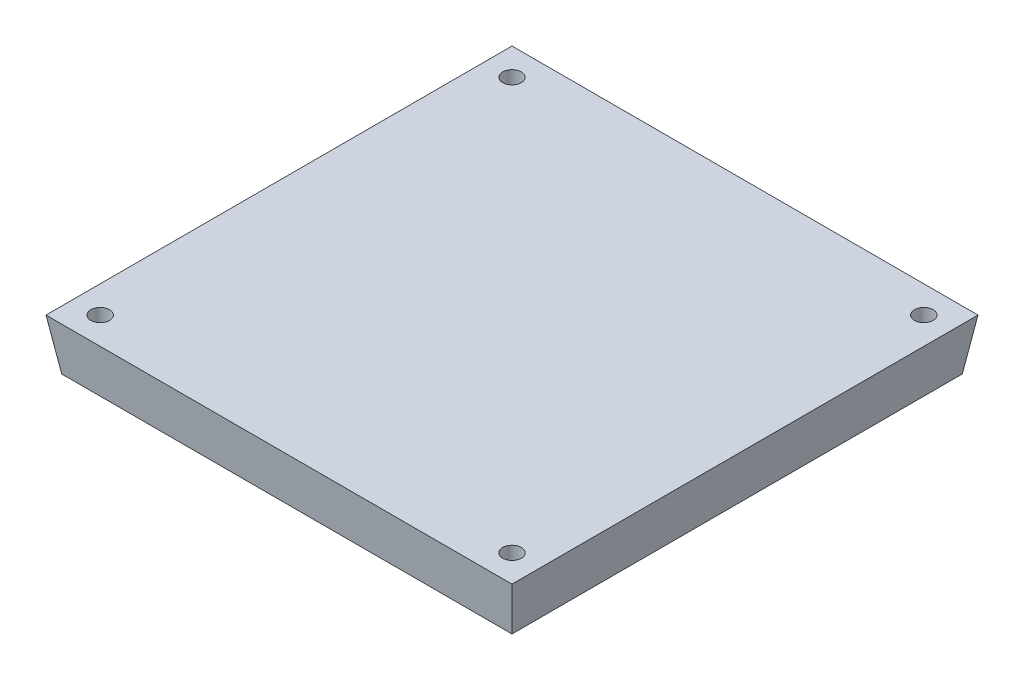
ISO-10303-21;
HEADER;
FILE_DESCRIPTION(('STEP AP214'),'2;1');
FILE_NAME('part.step','',(''),(''),'','','');
FILE_SCHEMA(('AUTOMOTIVE_DESIGN { 1 0 10303 214 1 1 1 1 }'));
ENDSEC;
DATA;
#1=APPLICATION_CONTEXT('core data for automotive mechanical design processes');
#2=APPLICATION_PROTOCOL_DEFINITION('international standard','automotive_design',2000,#1);
#3=PRODUCT_CONTEXT('',#1,'mechanical');
#4=PRODUCT('Part','Part','',(#3));
#5=PRODUCT_RELATED_PRODUCT_CATEGORY('part','',(#4));
#6=PRODUCT_DEFINITION_FORMATION('','',#4);
#7=PRODUCT_DEFINITION_CONTEXT('part definition',#1,'design');
#8=PRODUCT_DEFINITION('design','',#6,#7);
#9=PRODUCT_DEFINITION_SHAPE('','',#8);
#10=(LENGTH_UNIT() NAMED_UNIT(*) SI_UNIT(.MILLI.,.METRE.));
#11=(NAMED_UNIT(*) PLANE_ANGLE_UNIT() SI_UNIT($,.RADIAN.));
#12=(NAMED_UNIT(*) SI_UNIT($,.STERADIAN.) SOLID_ANGLE_UNIT());
#13=UNCERTAINTY_MEASURE_WITH_UNIT(LENGTH_MEASURE(1.E-05),#10,'distance_accuracy_value','');
#14=(GEOMETRIC_REPRESENTATION_CONTEXT(3) GLOBAL_UNCERTAINTY_ASSIGNED_CONTEXT((#13)) GLOBAL_UNIT_ASSIGNED_CONTEXT((#10,
#11,#12)) REPRESENTATION_CONTEXT('',''));
#15=CARTESIAN_POINT('',(0.,0.,0.));
#16=DIRECTION('',(0.,0.,1.));
#17=DIRECTION('',(1.,0.,0.));
#18=AXIS2_PLACEMENT_3D('',#15,#16,#17);
#19=CARTESIAN_POINT('',(36.15,0.,-36.15));
#20=DIRECTION('',(0.988308349175247,-0.152468380166177,0.));
#21=DIRECTION('',(0.152468380166177,0.988308349175247,0.));
#22=AXIS2_PLACEMENT_3D('',#19,#20,#21);
#23=PLANE('',#22);
#24=DIRECTION('',(0.,0.,-1.));
#25=VECTOR('',#24,1.);
#26=CARTESIAN_POINT('',(36.15,0.,-36.15));
#27=LINE('',#26,#25);
#28=CARTESIAN_POINT('',(36.15,0.,36.15));
#29=VERTEX_POINT('',#28);
#30=CARTESIAN_POINT('',(36.15,0.,-36.15));
#31=VERTEX_POINT('',#30);
#32=EDGE_CURVE('E93',#29,#31,#27,.T.);
#33=ORIENTED_EDGE('',*,*,#32,.T.);
#34=DIRECTION('',(-0.150726505265711,-0.977017421144972,0.150726505265711));
#35=VECTOR('',#34,1.);
#36=CARTESIAN_POINT('',(34.5074539401309,-10.6470730724906,-34.5074539401309));
#37=LINE('',#36,#35);
#38=CARTESIAN_POINT('',(37.4150310183112,8.2,-37.4150310183112));
#39=VERTEX_POINT('',#38);
#40=EDGE_CURVE('E11',#39,#31,#37,.T.);
#41=ORIENTED_EDGE('',*,*,#40,.F.);
#42=DIRECTION('',(0.,0.,1.));
#43=VECTOR('',#42,1.);
#44=CARTESIAN_POINT('',(37.4150310183112,8.2,-36.15));
#45=LINE('',#44,#43);
#46=CARTESIAN_POINT('',(37.4150310183112,8.2,37.4150310183112));
#47=VERTEX_POINT('',#46);
#48=EDGE_CURVE('E119',#47,#39,#45,.F.);
#49=ORIENTED_EDGE('',*,*,#48,.F.);
#50=DIRECTION('',(-0.150726505265712,-0.977017421144972,-0.150726505265711));
#51=VECTOR('',#50,1.);
#52=CARTESIAN_POINT('',(34.5074539401309,-10.6470730724906,34.5074539401309));
#53=LINE('',#52,#51);
#54=EDGE_CURVE('E105',#47,#29,#53,.T.);
#55=ORIENTED_EDGE('',*,*,#54,.T.);
#56=EDGE_LOOP('',(#33,#41,#49,#55));
#57=FACE_BOUND('',#56,.T.);
#58=ADVANCED_FACE('F45',(#57),#23,.T.);
#59=CARTESIAN_POINT('',(-36.15,0.,-36.15));
#60=DIRECTION('',(0.,-0.152468380166177,-0.988308349175247));
#61=DIRECTION('',(0.,0.988308349175247,-0.152468380166177));
#62=AXIS2_PLACEMENT_3D('',#59,#60,#61);
#63=PLANE('',#62);
#64=DIRECTION('',(-1.,0.,0.));
#65=VECTOR('',#64,1.);
#66=CARTESIAN_POINT('',(-36.15,0.,-36.15));
#67=LINE('',#66,#65);
#68=CARTESIAN_POINT('',(-36.15,0.,-36.15));
#69=VERTEX_POINT('',#68);
#70=EDGE_CURVE('E89',#31,#69,#67,.T.);
#71=ORIENTED_EDGE('',*,*,#70,.T.);
#72=DIRECTION('',(0.150726505265712,-0.977017421144972,0.150726505265711));
#73=VECTOR('',#72,1.);
#74=CARTESIAN_POINT('',(-36.15,0.,-36.15));
#75=LINE('',#74,#73);
#76=CARTESIAN_POINT('',(-37.4150310183112,8.2,-37.4150310183112));
#77=VERTEX_POINT('',#76);
#78=EDGE_CURVE('E55',#77,#69,#75,.T.);
#79=ORIENTED_EDGE('',*,*,#78,.F.);
#80=DIRECTION('',(1.,0.,0.));
#81=VECTOR('',#80,1.);
#82=CARTESIAN_POINT('',(-36.15,8.2,-37.4150310183112));
#83=LINE('',#82,#81);
#84=EDGE_CURVE('E101',#39,#77,#83,.F.);
#85=ORIENTED_EDGE('',*,*,#84,.F.);
#86=ORIENTED_EDGE('',*,*,#40,.T.);
#87=EDGE_LOOP('',(#71,#79,#85,#86));
#88=FACE_BOUND('',#87,.T.);
#89=ADVANCED_FACE('F47',(#88),#63,.T.);
#90=CARTESIAN_POINT('',(-36.15,0.,-36.15));
#91=DIRECTION('',(-0.988308349175247,-0.152468380166177,0.));
#92=DIRECTION('',(0.152468380166177,-0.988308349175247,0.));
#93=AXIS2_PLACEMENT_3D('',#90,#91,#92);
#94=PLANE('',#93);
#95=DIRECTION('',(0.,0.,1.));
#96=VECTOR('',#95,1.);
#97=CARTESIAN_POINT('',(-36.15,0.,-36.15));
#98=LINE('',#97,#96);
#99=CARTESIAN_POINT('',(-36.15,0.,36.15));
#100=VERTEX_POINT('',#99);
#101=EDGE_CURVE('E94',#69,#100,#98,.T.);
#102=ORIENTED_EDGE('',*,*,#101,.T.);
#103=DIRECTION('',(0.150726505265711,-0.977017421144972,-0.150726505265711));
#104=VECTOR('',#103,1.);
#105=CARTESIAN_POINT('',(-36.15,0.,36.15));
#106=LINE('',#105,#104);
#107=CARTESIAN_POINT('',(-37.4150310183112,8.2,37.4150310183112));
#108=VERTEX_POINT('',#107);
#109=EDGE_CURVE('E123',#108,#100,#106,.T.);
#110=ORIENTED_EDGE('',*,*,#109,.F.);
#111=DIRECTION('',(0.,0.,-1.));
#112=VECTOR('',#111,1.);
#113=CARTESIAN_POINT('',(-37.4150310183112,8.2,-36.15));
#114=LINE('',#113,#112);
#115=EDGE_CURVE('E68',#77,#108,#114,.F.);
#116=ORIENTED_EDGE('',*,*,#115,.F.);
#117=ORIENTED_EDGE('',*,*,#78,.T.);
#118=EDGE_LOOP('',(#102,#110,#116,#117));
#119=FACE_BOUND('',#118,.T.);
#120=ADVANCED_FACE('F171',(#119),#94,.T.);
#121=CARTESIAN_POINT('',(-36.15,0.,36.15));
#122=DIRECTION('',(0.,-0.152468380166177,0.988308349175247));
#123=DIRECTION('',(0.,-0.988308349175247,-0.152468380166177));
#124=AXIS2_PLACEMENT_3D('',#121,#122,#123);
#125=PLANE('',#124);
#126=DIRECTION('',(1.,0.,0.));
#127=VECTOR('',#126,1.);
#128=CARTESIAN_POINT('',(-36.15,0.,36.15));
#129=LINE('',#128,#127);
#130=EDGE_CURVE('E117',#100,#29,#129,.T.);
#131=ORIENTED_EDGE('',*,*,#130,.T.);
#132=ORIENTED_EDGE('',*,*,#54,.F.);
#133=DIRECTION('',(-1.,0.,0.));
#134=VECTOR('',#133,1.);
#135=CARTESIAN_POINT('',(-36.15,8.2,37.4150310183112));
#136=LINE('',#135,#134);
#137=EDGE_CURVE('E63',#108,#47,#136,.F.);
#138=ORIENTED_EDGE('',*,*,#137,.F.);
#139=ORIENTED_EDGE('',*,*,#109,.T.);
#140=EDGE_LOOP('',(#131,#132,#138,#139));
#141=FACE_BOUND('',#140,.T.);
#142=ADVANCED_FACE('F175',(#141),#125,.T.);
#143=CARTESIAN_POINT('',(0.,8.2,0.));
#144=DIRECTION('',(0.,1.,0.));
#145=DIRECTION('',(0.,0.,1.));
#146=AXIS2_PLACEMENT_3D('',#143,#144,#145);
#147=PLANE('',#146);
#148=CARTESIAN_POINT('',(-33.0666010183116,8.2,33.0666010183109));
#149=DIRECTION('',(0.,1.,0.));
#150=DIRECTION('',(0.,0.,1.));
#151=AXIS2_PLACEMENT_3D('',#148,#149,#150);
#152=CIRCLE('',#151,1.50000000000001);
#153=CARTESIAN_POINT('',(-33.0666010183116,8.2,34.5666010183109));
#154=VERTEX_POINT('',#153);
#155=EDGE_CURVE('E210',#154,#154,#152,.T.);
#156=ORIENTED_EDGE('',*,*,#155,.F.);
#157=EDGE_LOOP('',(#156));
#158=FACE_BOUND('',#157,.T.);
#159=CARTESIAN_POINT('',(33.066601018311,8.2,33.0666010183115));
#160=DIRECTION('',(0.,1.,0.));
#161=DIRECTION('',(0.,0.,1.));
#162=AXIS2_PLACEMENT_3D('',#159,#160,#161);
#163=CIRCLE('',#162,1.50000000000001);
#164=CARTESIAN_POINT('',(33.066601018311,8.2,34.5666010183115));
#165=VERTEX_POINT('',#164);
#166=EDGE_CURVE('E206',#165,#165,#163,.T.);
#167=ORIENTED_EDGE('',*,*,#166,.F.);
#168=EDGE_LOOP('',(#167));
#169=FACE_BOUND('',#168,.T.);
#170=CARTESIAN_POINT('',(33.0666010183114,8.2,-33.0666010183111));
#171=DIRECTION('',(0.,1.,0.));
#172=DIRECTION('',(0.,0.,1.));
#173=AXIS2_PLACEMENT_3D('',#170,#171,#172);
#174=CIRCLE('',#173,1.5);
#175=CARTESIAN_POINT('',(33.0666010183114,8.2,-31.5666010183111));
#176=VERTEX_POINT('',#175);
#177=EDGE_CURVE('E203',#176,#176,#174,.T.);
#178=ORIENTED_EDGE('',*,*,#177,.F.);
#179=EDGE_LOOP('',(#178));
#180=FACE_BOUND('',#179,.T.);
#181=CARTESIAN_POINT('',(-33.0666010183112,8.2,-33.0666010183112));
#182=DIRECTION('',(0.,1.,0.));
#183=DIRECTION('',(0.,0.,1.));
#184=AXIS2_PLACEMENT_3D('',#181,#182,#183);
#185=CIRCLE('',#184,1.5);
#186=CARTESIAN_POINT('',(-33.0666010183112,8.2,-31.5666010183112));
#187=VERTEX_POINT('',#186);
#188=EDGE_CURVE('E112',#187,#187,#185,.T.);
#189=ORIENTED_EDGE('',*,*,#188,.F.);
#190=EDGE_LOOP('',(#189));
#191=FACE_BOUND('',#190,.T.);
#192=ORIENTED_EDGE('',*,*,#48,.T.);
#193=ORIENTED_EDGE('',*,*,#84,.T.);
#194=ORIENTED_EDGE('',*,*,#115,.T.);
#195=ORIENTED_EDGE('',*,*,#137,.T.);
#196=EDGE_LOOP('',(#192,#193,#194,#195));
#197=FACE_BOUND('',#196,.T.);
#198=ADVANCED_FACE('F177',(#158,#169,#180,#191,#197),#147,.T.);
#199=CARTESIAN_POINT('',(0.,0.,0.));
#200=DIRECTION('',(0.,1.,0.));
#201=DIRECTION('',(0.,0.,1.));
#202=AXIS2_PLACEMENT_3D('',#199,#200,#201);
#203=PLANE('',#202);
#204=CARTESIAN_POINT('',(-33.0666010183116,0.,33.0666010183109));
#205=DIRECTION('',(0.,1.,0.));
#206=DIRECTION('',(0.,0.,1.));
#207=AXIS2_PLACEMENT_3D('',#204,#205,#206);
#208=CIRCLE('',#207,1.50000000000001);
#209=CARTESIAN_POINT('',(-33.0666010183116,0.,34.5666010183109));
#210=VERTEX_POINT('',#209);
#211=EDGE_CURVE('E49',#210,#210,#208,.T.);
#212=ORIENTED_EDGE('',*,*,#211,.T.);
#213=EDGE_LOOP('',(#212));
#214=FACE_BOUND('',#213,.T.);
#215=CARTESIAN_POINT('',(33.066601018311,0.,33.0666010183115));
#216=DIRECTION('',(0.,1.,0.));
#217=DIRECTION('',(0.,0.,1.));
#218=AXIS2_PLACEMENT_3D('',#215,#216,#217);
#219=CIRCLE('',#218,1.50000000000001);
#220=CARTESIAN_POINT('',(33.066601018311,0.,34.5666010183115));
#221=VERTEX_POINT('',#220);
#222=EDGE_CURVE('E110',#221,#221,#219,.T.);
#223=ORIENTED_EDGE('',*,*,#222,.T.);
#224=EDGE_LOOP('',(#223));
#225=FACE_BOUND('',#224,.T.);
#226=CARTESIAN_POINT('',(33.0666010183114,0.,-33.0666010183111));
#227=DIRECTION('',(0.,1.,0.));
#228=DIRECTION('',(0.,0.,1.));
#229=AXIS2_PLACEMENT_3D('',#226,#227,#228);
#230=CIRCLE('',#229,1.5);
#231=CARTESIAN_POINT('',(33.0666010183114,0.,-31.5666010183111));
#232=VERTEX_POINT('',#231);
#233=EDGE_CURVE('E141',#232,#232,#230,.T.);
#234=ORIENTED_EDGE('',*,*,#233,.T.);
#235=EDGE_LOOP('',(#234));
#236=FACE_BOUND('',#235,.T.);
#237=CARTESIAN_POINT('',(-33.0666010183112,0.,-33.0666010183112));
#238=DIRECTION('',(0.,1.,0.));
#239=DIRECTION('',(0.,0.,1.));
#240=AXIS2_PLACEMENT_3D('',#237,#238,#239);
#241=CIRCLE('',#240,1.5);
#242=CARTESIAN_POINT('',(-33.0666010183112,0.,-31.5666010183112));
#243=VERTEX_POINT('',#242);
#244=EDGE_CURVE('E137',#243,#243,#241,.T.);
#245=ORIENTED_EDGE('',*,*,#244,.T.);
#246=EDGE_LOOP('',(#245));
#247=FACE_BOUND('',#246,.T.);
#248=ORIENTED_EDGE('',*,*,#32,.F.);
#249=ORIENTED_EDGE('',*,*,#130,.F.);
#250=ORIENTED_EDGE('',*,*,#101,.F.);
#251=ORIENTED_EDGE('',*,*,#70,.F.);
#252=EDGE_LOOP('',(#248,#249,#250,#251));
#253=FACE_BOUND('',#252,.T.);
#254=ADVANCED_FACE('F90',(#214,#225,#236,#247,#253),#203,.F.);
#255=CARTESIAN_POINT('',(-33.0666010183112,-1.8,-33.0666010183112));
#256=DIRECTION('',(0.,1.,0.));
#257=DIRECTION('',(0.,0.,1.));
#258=AXIS2_PLACEMENT_3D('',#255,#256,#257);
#259=CYLINDRICAL_SURFACE('',#258,1.5);
#260=ORIENTED_EDGE('',*,*,#188,.T.);
#261=EDGE_LOOP('',(#260));
#262=FACE_BOUND('',#261,.T.);
#263=ORIENTED_EDGE('',*,*,#244,.F.);
#264=EDGE_LOOP('',(#263));
#265=FACE_BOUND('',#264,.T.);
#266=ADVANCED_FACE('F162',(#262,#265),#259,.F.);
#267=CARTESIAN_POINT('',(33.0666010183114,-1.8,-33.0666010183111));
#268=DIRECTION('',(0.,1.,0.));
#269=DIRECTION('',(0.,0.,1.));
#270=AXIS2_PLACEMENT_3D('',#267,#268,#269);
#271=CYLINDRICAL_SURFACE('',#270,1.5);
#272=ORIENTED_EDGE('',*,*,#177,.T.);
#273=EDGE_LOOP('',(#272));
#274=FACE_BOUND('',#273,.T.);
#275=ORIENTED_EDGE('',*,*,#233,.F.);
#276=EDGE_LOOP('',(#275));
#277=FACE_BOUND('',#276,.T.);
#278=ADVANCED_FACE('F153',(#274,#277),#271,.F.);
#279=CARTESIAN_POINT('',(33.066601018311,-1.8,33.0666010183115));
#280=DIRECTION('',(0.,1.,0.));
#281=DIRECTION('',(0.,0.,1.));
#282=AXIS2_PLACEMENT_3D('',#279,#280,#281);
#283=CYLINDRICAL_SURFACE('',#282,1.50000000000001);
#284=ORIENTED_EDGE('',*,*,#166,.T.);
#285=EDGE_LOOP('',(#284));
#286=FACE_BOUND('',#285,.T.);
#287=ORIENTED_EDGE('',*,*,#222,.F.);
#288=EDGE_LOOP('',(#287));
#289=FACE_BOUND('',#288,.T.);
#290=ADVANCED_FACE('F150',(#286,#289),#283,.F.);
#291=CARTESIAN_POINT('',(-33.0666010183116,-1.8,33.0666010183109));
#292=DIRECTION('',(0.,1.,0.));
#293=DIRECTION('',(0.,0.,1.));
#294=AXIS2_PLACEMENT_3D('',#291,#292,#293);
#295=CYLINDRICAL_SURFACE('',#294,1.50000000000001);
#296=ORIENTED_EDGE('',*,*,#155,.T.);
#297=EDGE_LOOP('',(#296));
#298=FACE_BOUND('',#297,.T.);
#299=ORIENTED_EDGE('',*,*,#211,.F.);
#300=EDGE_LOOP('',(#299));
#301=FACE_BOUND('',#300,.T.);
#302=ADVANCED_FACE('F152',(#298,#301),#295,.F.);
#303=CLOSED_SHELL('',(#58,#89,#120,#142,#198,#254,#266,#278,#290,#302));
#304=MANIFOLD_SOLID_BREP('B2',#303);
#305=ADVANCED_BREP_SHAPE_REPRESENTATION('',(#18,#304),#14);
#306=SHAPE_DEFINITION_REPRESENTATION(#9,#305);
ENDSEC;
END-ISO-10303-21;
